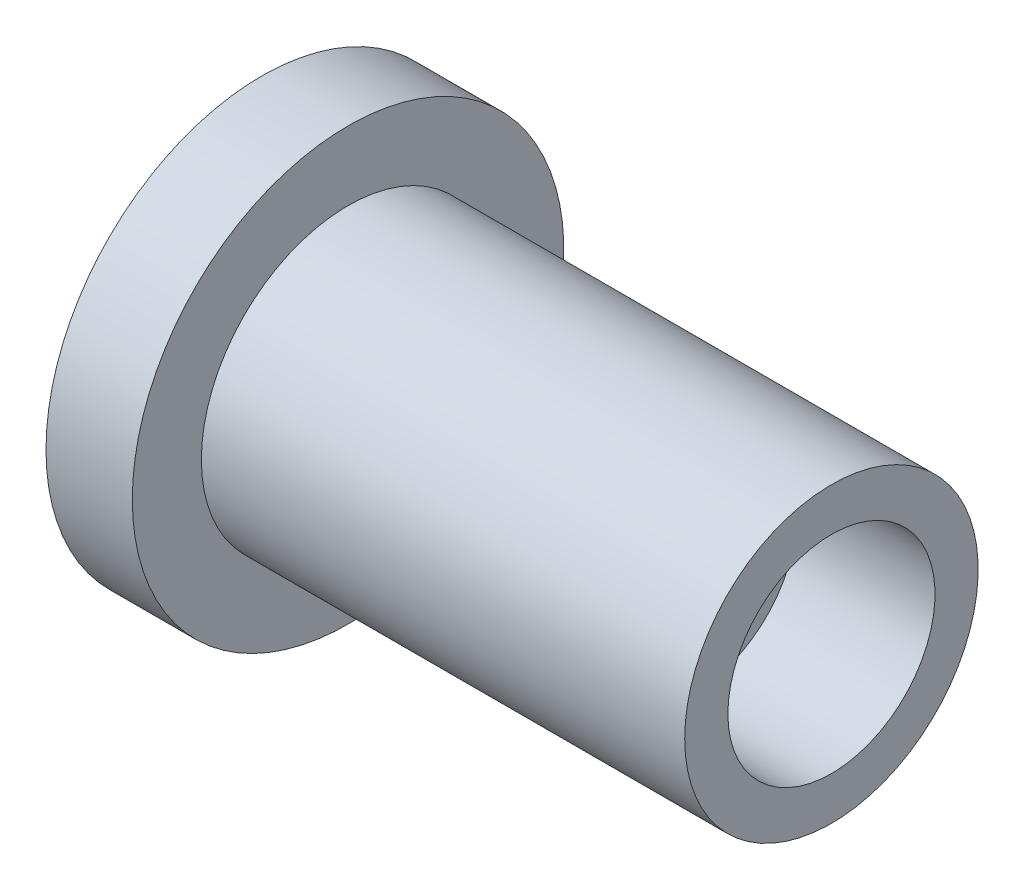
ISO-10303-21;
HEADER;
FILE_DESCRIPTION(('STEP AP214'),'2;1');
FILE_NAME('part.step','',(''),(''),'','','');
FILE_SCHEMA(('AUTOMOTIVE_DESIGN { 1 0 10303 214 1 1 1 1 }'));
ENDSEC;
DATA;
#1=APPLICATION_CONTEXT('core data for automotive mechanical design processes');
#2=APPLICATION_PROTOCOL_DEFINITION('international standard','automotive_design',2000,#1);
#3=PRODUCT_CONTEXT('',#1,'mechanical');
#4=PRODUCT('Part','Part','',(#3));
#5=PRODUCT_RELATED_PRODUCT_CATEGORY('part','',(#4));
#6=PRODUCT_DEFINITION_FORMATION('','',#4);
#7=PRODUCT_DEFINITION_CONTEXT('part definition',#1,'design');
#8=PRODUCT_DEFINITION('design','',#6,#7);
#9=PRODUCT_DEFINITION_SHAPE('','',#8);
#10=(LENGTH_UNIT() NAMED_UNIT(*) SI_UNIT(.MILLI.,.METRE.));
#11=(NAMED_UNIT(*) PLANE_ANGLE_UNIT() SI_UNIT($,.RADIAN.));
#12=(NAMED_UNIT(*) SI_UNIT($,.STERADIAN.) SOLID_ANGLE_UNIT());
#13=UNCERTAINTY_MEASURE_WITH_UNIT(LENGTH_MEASURE(1.E-05),#10,'distance_accuracy_value','');
#14=(GEOMETRIC_REPRESENTATION_CONTEXT(3) GLOBAL_UNCERTAINTY_ASSIGNED_CONTEXT((#13)) GLOBAL_UNIT_ASSIGNED_CONTEXT((#10,
#11,#12)) REPRESENTATION_CONTEXT('',''));
#15=CARTESIAN_POINT('',(0.,0.,0.));
#16=DIRECTION('',(0.,0.,1.));
#17=DIRECTION('',(1.,0.,0.));
#18=AXIS2_PLACEMENT_3D('',#15,#16,#17);
#19=CARTESIAN_POINT('',(0.,0.,0.));
#20=DIRECTION('',(1.,0.,0.));
#21=DIRECTION('',(0.,0.,-1.00000000000003));
#22=AXIS2_PLACEMENT_3D('',#19,#20,#21);
#23=PLANE('',#22);
#24=CARTESIAN_POINT('',(0.,0.,0.));
#25=DIRECTION('',(-1.,0.,0.));
#26=DIRECTION('',(0.,0.,1.00000000000003));
#27=AXIS2_PLACEMENT_3D('',#24,#25,#26);
#28=CIRCLE('',#27,6.);
#29=CARTESIAN_POINT('',(0.,1.2090328738168E-13,6.00000000000021));
#30=VERTEX_POINT('',#29);
#31=EDGE_CURVE('E12',#30,#30,#28,.T.);
#32=ORIENTED_EDGE('',*,*,#31,.T.);
#33=EDGE_LOOP('',(#32));
#34=FACE_BOUND('',#33,.T.);
#35=ADVANCED_FACE('F45',(#34),#23,.F.);
#36=CARTESIAN_POINT('',(0.,0.,0.));
#37=DIRECTION('',(-1.,0.,0.));
#38=DIRECTION('',(0.,0.,1.00000000000003));
#39=AXIS2_PLACEMENT_3D('',#36,#37,#38);
#40=CYLINDRICAL_SURFACE('',#39,6.);
#41=ORIENTED_EDGE('',*,*,#31,.F.);
#42=EDGE_LOOP('',(#41));
#43=FACE_BOUND('',#42,.T.);
#44=CARTESIAN_POINT('',(2.,0.,0.));
#45=DIRECTION('',(-1.,0.,0.));
#46=DIRECTION('',(0.,0.,1.00000000000003));
#47=AXIS2_PLACEMENT_3D('',#44,#45,#46);
#48=CIRCLE('',#47,6.);
#49=CARTESIAN_POINT('',(2.,1.21553808685171E-13,6.00000000000021));
#50=VERTEX_POINT('',#49);
#51=EDGE_CURVE('E51',#50,#50,#48,.T.);
#52=ORIENTED_EDGE('',*,*,#51,.T.);
#53=EDGE_LOOP('',(#52));
#54=FACE_BOUND('',#53,.T.);
#55=ADVANCED_FACE('F89',(#43,#54),#40,.T.);
#56=CARTESIAN_POINT('',(2.,6.0000000000001,1.14925430283463E-13));
#57=DIRECTION('',(1.,0.,0.));
#58=DIRECTION('',(0.,0.,-1.00000000000003));
#59=AXIS2_PLACEMENT_3D('',#56,#57,#58);
#60=PLANE('',#59);
#61=ORIENTED_EDGE('',*,*,#51,.F.);
#62=EDGE_LOOP('',(#61));
#63=FACE_BOUND('',#62,.T.);
#64=CARTESIAN_POINT('',(2.,0.,0.));
#65=DIRECTION('',(-1.,0.,0.));
#66=DIRECTION('',(0.,0.,1.00000000000003));
#67=AXIS2_PLACEMENT_3D('',#64,#65,#66);
#68=CIRCLE('',#67,12.5);
#69=CARTESIAN_POINT('',(2.,2.52532370015324E-13,12.5000000000004));
#70=VERTEX_POINT('',#69);
#71=EDGE_CURVE('E55',#70,#70,#68,.T.);
#72=ORIENTED_EDGE('',*,*,#71,.T.);
#73=EDGE_LOOP('',(#72));
#74=FACE_BOUND('',#73,.T.);
#75=ADVANCED_FACE('F93',(#63,#74),#60,.F.);
#76=CARTESIAN_POINT('',(0.,0.,0.));
#77=DIRECTION('',(-1.,0.,0.));
#78=DIRECTION('',(0.,0.,1.00000000000003));
#79=AXIS2_PLACEMENT_3D('',#76,#77,#78);
#80=CYLINDRICAL_SURFACE('',#79,12.5);
#81=ORIENTED_EDGE('',*,*,#71,.F.);
#82=EDGE_LOOP('',(#81));
#83=FACE_BOUND('',#82,.T.);
#84=CARTESIAN_POINT('',(7.,0.,0.));
#85=DIRECTION('',(-1.,0.,0.));
#86=DIRECTION('',(0.,0.,1.00000000000003));
#87=AXIS2_PLACEMENT_3D('',#84,#85,#86);
#88=CIRCLE('',#87,12.5);
#89=CARTESIAN_POINT('',(7.,2.53399731753312E-13,12.5000000000004));
#90=VERTEX_POINT('',#89);
#91=EDGE_CURVE('E59',#90,#90,#88,.T.);
#92=ORIENTED_EDGE('',*,*,#91,.T.);
#93=EDGE_LOOP('',(#92));
#94=FACE_BOUND('',#93,.T.);
#95=ADVANCED_FACE('F98',(#83,#94),#80,.T.);
#96=CARTESIAN_POINT('',(7.,12.5000000000002,2.4459601011273E-13));
#97=DIRECTION('',(-1.,0.,0.));
#98=DIRECTION('',(0.,0.,1.00000000000003));
#99=AXIS2_PLACEMENT_3D('',#96,#97,#98);
#100=PLANE('',#99);
#101=ORIENTED_EDGE('',*,*,#91,.F.);
#102=EDGE_LOOP('',(#101));
#103=FACE_BOUND('',#102,.T.);
#104=CARTESIAN_POINT('',(7.,0.,0.));
#105=DIRECTION('',(-1.,0.,0.));
#106=DIRECTION('',(0.,0.,1.00000000000003));
#107=AXIS2_PLACEMENT_3D('',#104,#105,#106);
#108=CIRCLE('',#107,8.5);
#109=CARTESIAN_POINT('',(7.,1.72797540165526E-13,8.50000000000029));
#110=VERTEX_POINT('',#109);
#111=EDGE_CURVE('E64',#110,#110,#108,.T.);
#112=ORIENTED_EDGE('',*,*,#111,.T.);
#113=EDGE_LOOP('',(#112));
#114=FACE_BOUND('',#113,.T.);
#115=ADVANCED_FACE('F104',(#103,#114),#100,.F.);
#116=CARTESIAN_POINT('',(0.,0.,0.));
#117=DIRECTION('',(-1.,0.,0.));
#118=DIRECTION('',(0.,0.,1.00000000000003));
#119=AXIS2_PLACEMENT_3D('',#116,#117,#118);
#120=CYLINDRICAL_SURFACE('',#119,8.5);
#121=ORIENTED_EDGE('',*,*,#111,.F.);
#122=EDGE_LOOP('',(#121));
#123=FACE_BOUND('',#122,.T.);
#124=CARTESIAN_POINT('',(35.,0.,0.));
#125=DIRECTION('',(-1.,0.,0.));
#126=DIRECTION('',(0.,0.,1.00000000000003));
#127=AXIS2_PLACEMENT_3D('',#124,#125,#126);
#128=CIRCLE('',#127,8.5);
#129=CARTESIAN_POINT('',(35.,1.72147018862034E-13,8.50000000000029));
#130=VERTEX_POINT('',#129);
#131=EDGE_CURVE('E67',#130,#130,#128,.T.);
#132=ORIENTED_EDGE('',*,*,#131,.T.);
#133=EDGE_LOOP('',(#132));
#134=FACE_BOUND('',#133,.T.);
#135=ADVANCED_FACE('F108',(#123,#134),#120,.T.);
#136=CARTESIAN_POINT('',(35.,8.50000000000015,1.66967134562768E-13));
#137=DIRECTION('',(-1.,0.,0.));
#138=DIRECTION('',(0.,0.,1.00000000000003));
#139=AXIS2_PLACEMENT_3D('',#136,#137,#138);
#140=PLANE('',#139);
#141=ORIENTED_EDGE('',*,*,#131,.F.);
#142=EDGE_LOOP('',(#141));
#143=FACE_BOUND('',#142,.T.);
#144=CARTESIAN_POINT('',(35.,0.,0.));
#145=DIRECTION('',(-1.,0.,0.));
#146=DIRECTION('',(0.,0.,1.00000000000003));
#147=AXIS2_PLACEMENT_3D('',#144,#145,#146);
#148=CIRCLE('',#147,6.);
#149=CARTESIAN_POINT('',(35.,1.21770649119668E-13,6.00000000000021));
#150=VERTEX_POINT('',#149);
#151=EDGE_CURVE('E70',#150,#150,#148,.T.);
#152=ORIENTED_EDGE('',*,*,#151,.T.);
#153=EDGE_LOOP('',(#152));
#154=FACE_BOUND('',#153,.T.);
#155=ADVANCED_FACE('F85',(#143,#154),#140,.F.);
#156=CARTESIAN_POINT('',(0.,0.,0.));
#157=DIRECTION('',(-1.,0.,0.));
#158=DIRECTION('',(0.,0.,1.00000000000003));
#159=AXIS2_PLACEMENT_3D('',#156,#157,#158);
#160=CYLINDRICAL_SURFACE('',#159,6.);
#161=ORIENTED_EDGE('',*,*,#151,.F.);
#162=EDGE_LOOP('',(#161));
#163=FACE_BOUND('',#162,.T.);
#164=CARTESIAN_POINT('',(27.,0.,0.));
#165=DIRECTION('',(-1.,0.,0.));
#166=DIRECTION('',(0.,0.,1.00000000000003));
#167=AXIS2_PLACEMENT_3D('',#164,#165,#166);
#168=CIRCLE('',#167,6.);
#169=CARTESIAN_POINT('',(27.,1.21336968250674E-13,6.00000000000021));
#170=VERTEX_POINT('',#169);
#171=EDGE_CURVE('E73',#170,#170,#168,.T.);
#172=ORIENTED_EDGE('',*,*,#171,.T.);
#173=EDGE_LOOP('',(#172));
#174=FACE_BOUND('',#173,.T.);
#175=ADVANCED_FACE('F77',(#163,#174),#160,.F.);
#176=CARTESIAN_POINT('',(27.,6.0000000000001,1.1666015375944E-13));
#177=DIRECTION('',(-1.,0.,0.));
#178=DIRECTION('',(0.,0.,1.00000000000003));
#179=AXIS2_PLACEMENT_3D('',#176,#177,#178);
#180=PLANE('',#179);
#181=ORIENTED_EDGE('',*,*,#171,.F.);
#182=EDGE_LOOP('',(#181));
#183=FACE_BOUND('',#182,.T.);
#184=ADVANCED_FACE('F79',(#183),#180,.F.);
#185=CLOSED_SHELL('',(#35,#55,#75,#95,#115,#135,#155,#175,#184));
#186=MANIFOLD_SOLID_BREP('B2',#185);
#187=ADVANCED_BREP_SHAPE_REPRESENTATION('',(#18,#186),#14);
#188=SHAPE_DEFINITION_REPRESENTATION(#9,#187);
ENDSEC;
END-ISO-10303-21;
